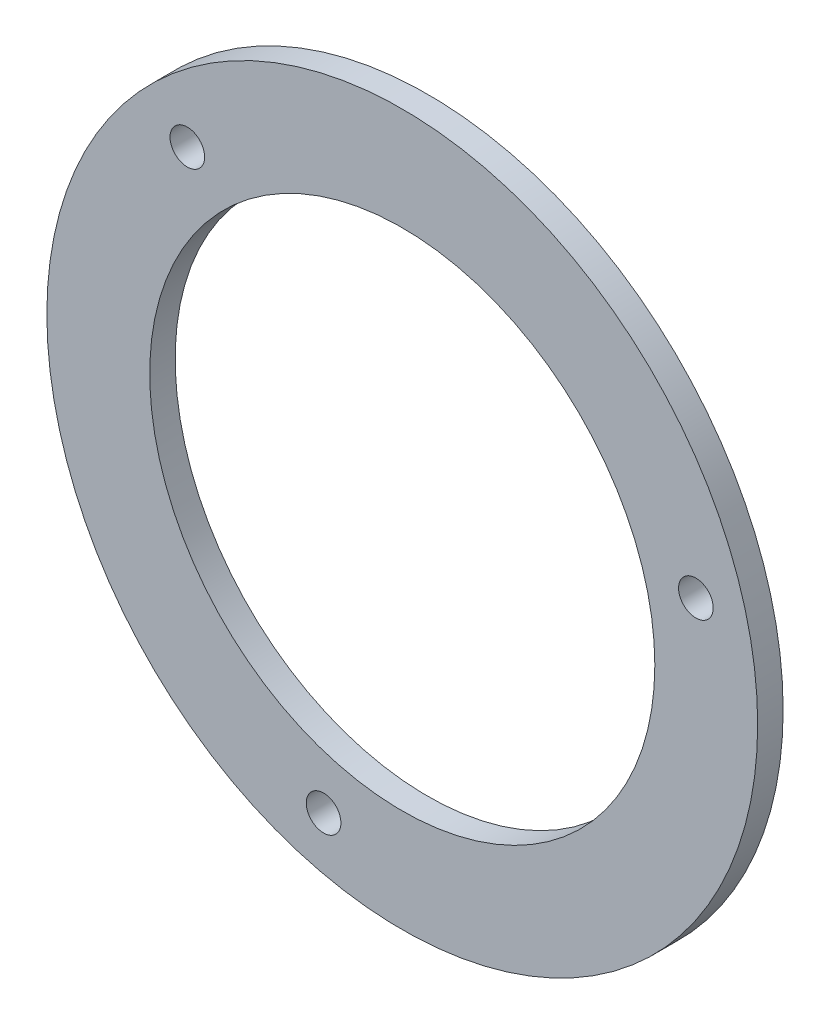
ISO-10303-21;
HEADER;
FILE_DESCRIPTION(('STEP AP214'),'2;1');
FILE_NAME('part.step','',(''),(''),'','','');
FILE_SCHEMA(('AUTOMOTIVE_DESIGN { 1 0 10303 214 1 1 1 1 }'));
ENDSEC;
DATA;
#1=APPLICATION_CONTEXT('core data for automotive mechanical design processes');
#2=APPLICATION_PROTOCOL_DEFINITION('international standard','automotive_design',2000,#1);
#3=PRODUCT_CONTEXT('',#1,'mechanical');
#4=PRODUCT('Part','Part','',(#3));
#5=PRODUCT_RELATED_PRODUCT_CATEGORY('part','',(#4));
#6=PRODUCT_DEFINITION_FORMATION('','',#4);
#7=PRODUCT_DEFINITION_CONTEXT('part definition',#1,'design');
#8=PRODUCT_DEFINITION('design','',#6,#7);
#9=PRODUCT_DEFINITION_SHAPE('','',#8);
#10=(LENGTH_UNIT() NAMED_UNIT(*) SI_UNIT(.MILLI.,.METRE.));
#11=(NAMED_UNIT(*) PLANE_ANGLE_UNIT() SI_UNIT($,.RADIAN.));
#12=(NAMED_UNIT(*) SI_UNIT($,.STERADIAN.) SOLID_ANGLE_UNIT());
#13=UNCERTAINTY_MEASURE_WITH_UNIT(LENGTH_MEASURE(1.E-05),#10,'distance_accuracy_value','');
#14=(GEOMETRIC_REPRESENTATION_CONTEXT(3) GLOBAL_UNCERTAINTY_ASSIGNED_CONTEXT((#13)) GLOBAL_UNIT_ASSIGNED_CONTEXT((#10,
#11,#12)) REPRESENTATION_CONTEXT('',''));
#15=CARTESIAN_POINT('',(0.,0.,0.));
#16=DIRECTION('',(0.,0.,1.));
#17=DIRECTION('',(1.,0.,0.));
#18=AXIS2_PLACEMENT_3D('',#15,#16,#17);
#19=CARTESIAN_POINT('',(0.,0.,2.5));
#20=DIRECTION('',(0.,0.,1.));
#21=DIRECTION('',(1.,0.,0.));
#22=AXIS2_PLACEMENT_3D('',#19,#20,#21);
#23=PLANE('',#22);
#24=CARTESIAN_POINT('',(28.8328859147287,7.72574849631024,2.5));
#25=DIRECTION('',(0.,0.,1.));
#26=DIRECTION('',(1.,0.,0.));
#27=AXIS2_PLACEMENT_3D('',#24,#25,#26);
#28=CIRCLE('',#27,1.7);
#29=CARTESIAN_POINT('',(27.1328859147287,7.72574849631024,2.5));
#30=VERTEX_POINT('',#29);
#31=EDGE_CURVE('E72',#30,#30,#28,.F.);
#32=ORIENTED_EDGE('',*,*,#31,.T.);
#33=EDGE_LOOP('',(#32));
#34=FACE_BOUND('',#33,.T.);
#35=CARTESIAN_POINT('',(-21.1071374184184,21.1071374184184,2.5));
#36=DIRECTION('',(0.,0.,1.));
#37=DIRECTION('',(1.,0.,0.));
#38=AXIS2_PLACEMENT_3D('',#35,#36,#37);
#39=CIRCLE('',#38,1.7);
#40=CARTESIAN_POINT('',(-22.8071374184184,21.1071374184184,2.5));
#41=VERTEX_POINT('',#40);
#42=EDGE_CURVE('E61',#41,#41,#39,.F.);
#43=ORIENTED_EDGE('',*,*,#42,.T.);
#44=EDGE_LOOP('',(#43));
#45=FACE_BOUND('',#44,.T.);
#46=CARTESIAN_POINT('',(-7.72574849631024,-28.8328859147287,2.5));
#47=DIRECTION('',(0.,0.,1.));
#48=DIRECTION('',(1.,0.,0.));
#49=AXIS2_PLACEMENT_3D('',#46,#47,#48);
#50=CIRCLE('',#49,1.7);
#51=CARTESIAN_POINT('',(-9.42574849631024,-28.8328859147287,2.5));
#52=VERTEX_POINT('',#51);
#53=EDGE_CURVE('E59',#52,#52,#50,.F.);
#54=ORIENTED_EDGE('',*,*,#53,.T.);
#55=EDGE_LOOP('',(#54));
#56=FACE_BOUND('',#55,.T.);
#57=CARTESIAN_POINT('',(0.,0.,2.5));
#58=DIRECTION('',(0.,0.,1.));
#59=DIRECTION('',(1.,0.,0.));
#60=AXIS2_PLACEMENT_3D('',#57,#58,#59);
#61=CIRCLE('',#60,34.9);
#62=CARTESIAN_POINT('',(34.9,0.,2.5));
#63=VERTEX_POINT('',#62);
#64=EDGE_CURVE('E10',#63,#63,#61,.T.);
#65=ORIENTED_EDGE('',*,*,#64,.T.);
#66=EDGE_LOOP('',(#65));
#67=FACE_BOUND('',#66,.T.);
#68=CARTESIAN_POINT('',(0.,0.,2.5));
#69=DIRECTION('',(0.,0.,1.));
#70=DIRECTION('',(1.,0.,0.));
#71=AXIS2_PLACEMENT_3D('',#68,#69,#70);
#72=CIRCLE('',#71,24.8);
#73=CARTESIAN_POINT('',(24.8,0.,2.5));
#74=VERTEX_POINT('',#73);
#75=EDGE_CURVE('E49',#74,#74,#72,.T.);
#76=ORIENTED_EDGE('',*,*,#75,.F.);
#77=EDGE_LOOP('',(#76));
#78=FACE_BOUND('',#77,.T.);
#79=ADVANCED_FACE('F40',(#34,#45,#56,#67,#78),#23,.T.);
#80=CARTESIAN_POINT('',(0.,0.,0.));
#81=DIRECTION('',(0.,0.,1.));
#82=DIRECTION('',(1.,0.,0.));
#83=AXIS2_PLACEMENT_3D('',#80,#81,#82);
#84=PLANE('',#83);
#85=CARTESIAN_POINT('',(28.8328859147287,7.72574849631024,0.));
#86=DIRECTION('',(0.,0.,1.));
#87=DIRECTION('',(1.,0.,0.));
#88=AXIS2_PLACEMENT_3D('',#85,#86,#87);
#89=CIRCLE('',#88,1.7);
#90=CARTESIAN_POINT('',(27.1328859147287,7.72574849631024,0.));
#91=VERTEX_POINT('',#90);
#92=EDGE_CURVE('E41',#91,#91,#89,.F.);
#93=ORIENTED_EDGE('',*,*,#92,.F.);
#94=EDGE_LOOP('',(#93));
#95=FACE_BOUND('',#94,.T.);
#96=CARTESIAN_POINT('',(-21.1071374184184,21.1071374184184,0.));
#97=DIRECTION('',(0.,0.,1.));
#98=DIRECTION('',(1.,0.,0.));
#99=AXIS2_PLACEMENT_3D('',#96,#97,#98);
#100=CIRCLE('',#99,1.7);
#101=CARTESIAN_POINT('',(-22.8071374184184,21.1071374184184,0.));
#102=VERTEX_POINT('',#101);
#103=EDGE_CURVE('E56',#102,#102,#100,.F.);
#104=ORIENTED_EDGE('',*,*,#103,.F.);
#105=EDGE_LOOP('',(#104));
#106=FACE_BOUND('',#105,.T.);
#107=CARTESIAN_POINT('',(-7.72574849631024,-28.8328859147287,0.));
#108=DIRECTION('',(0.,0.,1.));
#109=DIRECTION('',(1.,0.,0.));
#110=AXIS2_PLACEMENT_3D('',#107,#108,#109);
#111=CIRCLE('',#110,1.7);
#112=CARTESIAN_POINT('',(-9.42574849631024,-28.8328859147287,0.));
#113=VERTEX_POINT('',#112);
#114=EDGE_CURVE('E57',#113,#113,#111,.F.);
#115=ORIENTED_EDGE('',*,*,#114,.F.);
#116=EDGE_LOOP('',(#115));
#117=FACE_BOUND('',#116,.T.);
#118=CARTESIAN_POINT('',(0.,0.,0.));
#119=DIRECTION('',(0.,0.,1.));
#120=DIRECTION('',(1.,0.,0.));
#121=AXIS2_PLACEMENT_3D('',#118,#119,#120);
#122=CIRCLE('',#121,34.9);
#123=CARTESIAN_POINT('',(34.9,0.,0.));
#124=VERTEX_POINT('',#123);
#125=EDGE_CURVE('E44',#124,#124,#122,.T.);
#126=ORIENTED_EDGE('',*,*,#125,.F.);
#127=EDGE_LOOP('',(#126));
#128=FACE_BOUND('',#127,.T.);
#129=CARTESIAN_POINT('',(0.,0.,0.));
#130=DIRECTION('',(0.,0.,1.));
#131=DIRECTION('',(1.,0.,0.));
#132=AXIS2_PLACEMENT_3D('',#129,#130,#131);
#133=CIRCLE('',#132,24.8);
#134=CARTESIAN_POINT('',(24.8,0.,0.));
#135=VERTEX_POINT('',#134);
#136=EDGE_CURVE('E52',#135,#135,#133,.T.);
#137=ORIENTED_EDGE('',*,*,#136,.T.);
#138=EDGE_LOOP('',(#137));
#139=FACE_BOUND('',#138,.T.);
#140=ADVANCED_FACE('F78',(#95,#106,#117,#128,#139),#84,.F.);
#141=CARTESIAN_POINT('',(0.,0.,2.5));
#142=DIRECTION('',(0.,0.,-1.));
#143=DIRECTION('',(-1.,0.,0.));
#144=AXIS2_PLACEMENT_3D('',#141,#142,#143);
#145=CYLINDRICAL_SURFACE('',#144,34.9);
#146=ORIENTED_EDGE('',*,*,#64,.F.);
#147=EDGE_LOOP('',(#146));
#148=FACE_BOUND('',#147,.T.);
#149=ORIENTED_EDGE('',*,*,#125,.T.);
#150=EDGE_LOOP('',(#149));
#151=FACE_BOUND('',#150,.T.);
#152=ADVANCED_FACE('F39',(#148,#151),#145,.T.);
#153=CARTESIAN_POINT('',(0.,0.,2.5));
#154=DIRECTION('',(0.,0.,-1.));
#155=DIRECTION('',(-1.,0.,0.));
#156=AXIS2_PLACEMENT_3D('',#153,#154,#155);
#157=CYLINDRICAL_SURFACE('',#156,24.8);
#158=ORIENTED_EDGE('',*,*,#75,.T.);
#159=EDGE_LOOP('',(#158));
#160=FACE_BOUND('',#159,.T.);
#161=ORIENTED_EDGE('',*,*,#136,.F.);
#162=EDGE_LOOP('',(#161));
#163=FACE_BOUND('',#162,.T.);
#164=ADVANCED_FACE('F81',(#160,#163),#157,.F.);
#165=CARTESIAN_POINT('',(-7.72574849631024,-28.8328859147287,2.6));
#166=DIRECTION('',(0.,0.,-1.));
#167=DIRECTION('',(-1.,0.,0.));
#168=AXIS2_PLACEMENT_3D('',#165,#166,#167);
#169=CYLINDRICAL_SURFACE('',#168,1.7);
#170=CARTESIAN_POINT('',(-9.42574849631024,-28.8328859147287,2.5));
#171=CARTESIAN_POINT('',(-9.42574849631024,-28.8328859147287,2.47395833333333));
#172=CARTESIAN_POINT('',(-9.42574849631024,-28.8328859147287,2.44791666666667));
#173=CARTESIAN_POINT('',(-9.42574849631024,-28.8328859147287,2.39583333333333));
#174=CARTESIAN_POINT('',(-9.42574849631024,-28.8328859147287,2.36979166666667));
#175=CARTESIAN_POINT('',(-9.42574849631024,-28.8328859147287,2.31770833333333));
#176=CARTESIAN_POINT('',(-9.42574849631024,-28.8328859147287,2.29166666666667));
#177=CARTESIAN_POINT('',(-9.42574849631024,-28.8328859147287,2.23958333333333));
#178=CARTESIAN_POINT('',(-9.42574849631024,-28.8328859147287,2.21354166666667));
#179=CARTESIAN_POINT('',(-9.42574849631024,-28.8328859147287,2.16145833333333));
#180=CARTESIAN_POINT('',(-9.42574849631024,-28.8328859147287,2.13541666666667));
#181=CARTESIAN_POINT('',(-9.42574849631024,-28.8328859147287,2.08333333333333));
#182=CARTESIAN_POINT('',(-9.42574849631024,-28.8328859147287,2.05729166666667));
#183=CARTESIAN_POINT('',(-9.42574849631024,-28.8328859147287,2.00520833333333));
#184=CARTESIAN_POINT('',(-9.42574849631024,-28.8328859147287,1.97916666666667));
#185=CARTESIAN_POINT('',(-9.42574849631024,-28.8328859147287,1.92708333333333));
#186=CARTESIAN_POINT('',(-9.42574849631024,-28.8328859147287,1.90104166666667));
#187=CARTESIAN_POINT('',(-9.42574849631024,-28.8328859147287,1.84895833333333));
#188=CARTESIAN_POINT('',(-9.42574849631024,-28.8328859147287,1.82291666666667));
#189=CARTESIAN_POINT('',(-9.42574849631024,-28.8328859147287,1.77083333333333));
#190=CARTESIAN_POINT('',(-9.42574849631024,-28.8328859147287,1.74479166666667));
#191=CARTESIAN_POINT('',(-9.42574849631024,-28.8328859147287,1.69270833333333));
#192=CARTESIAN_POINT('',(-9.42574849631024,-28.8328859147287,1.66666666666667));
#193=CARTESIAN_POINT('',(-9.42574849631024,-28.8328859147287,1.61458333333333));
#194=CARTESIAN_POINT('',(-9.42574849631024,-28.8328859147287,1.58854166666667));
#195=CARTESIAN_POINT('',(-9.42574849631024,-28.8328859147287,1.53645833333333));
#196=CARTESIAN_POINT('',(-9.42574849631024,-28.8328859147287,1.51041666666667));
#197=CARTESIAN_POINT('',(-9.42574849631024,-28.8328859147287,1.45833333333333));
#198=CARTESIAN_POINT('',(-9.42574849631024,-28.8328859147287,1.43229166666667));
#199=CARTESIAN_POINT('',(-9.42574849631024,-28.8328859147287,1.38020833333333));
#200=CARTESIAN_POINT('',(-9.42574849631024,-28.8328859147287,1.35416666666667));
#201=CARTESIAN_POINT('',(-9.42574849631024,-28.8328859147287,1.30208333333333));
#202=CARTESIAN_POINT('',(-9.42574849631024,-28.8328859147287,1.27604166666667));
#203=CARTESIAN_POINT('',(-9.42574849631024,-28.8328859147287,1.22395833333333));
#204=CARTESIAN_POINT('',(-9.42574849631024,-28.8328859147287,1.19791666666667));
#205=CARTESIAN_POINT('',(-9.42574849631024,-28.8328859147287,1.14583333333333));
#206=CARTESIAN_POINT('',(-9.42574849631024,-28.8328859147287,1.11979166666667));
#207=CARTESIAN_POINT('',(-9.42574849631024,-28.8328859147287,1.06770833333333));
#208=CARTESIAN_POINT('',(-9.42574849631024,-28.8328859147287,1.04166666666667));
#209=CARTESIAN_POINT('',(-9.42574849631024,-28.8328859147287,0.989583333333333));
#210=CARTESIAN_POINT('',(-9.42574849631024,-28.8328859147287,0.963541666666667));
#211=CARTESIAN_POINT('',(-9.42574849631024,-28.8328859147287,0.911458333333333));
#212=CARTESIAN_POINT('',(-9.42574849631024,-28.8328859147287,0.885416666666666));
#213=CARTESIAN_POINT('',(-9.42574849631024,-28.8328859147287,0.833333333333333));
#214=CARTESIAN_POINT('',(-9.42574849631024,-28.8328859147287,0.807291666666666));
#215=CARTESIAN_POINT('',(-9.42574849631024,-28.8328859147287,0.755208333333333));
#216=CARTESIAN_POINT('',(-9.42574849631024,-28.8328859147287,0.729166666666667));
#217=CARTESIAN_POINT('',(-9.42574849631024,-28.8328859147287,0.677083333333333));
#218=CARTESIAN_POINT('',(-9.42574849631024,-28.8328859147287,0.651041666666666));
#219=CARTESIAN_POINT('',(-9.42574849631024,-28.8328859147287,0.598958333333333));
#220=CARTESIAN_POINT('',(-9.42574849631024,-28.8328859147287,0.572916666666666));
#221=CARTESIAN_POINT('',(-9.42574849631024,-28.8328859147287,0.520833333333333));
#222=CARTESIAN_POINT('',(-9.42574849631024,-28.8328859147287,0.494791666666666));
#223=CARTESIAN_POINT('',(-9.42574849631024,-28.8328859147287,0.442708333333333));
#224=CARTESIAN_POINT('',(-9.42574849631024,-28.8328859147287,0.416666666666666));
#225=CARTESIAN_POINT('',(-9.42574849631024,-28.8328859147287,0.364583333333333));
#226=CARTESIAN_POINT('',(-9.42574849631024,-28.8328859147287,0.338541666666667));
#227=CARTESIAN_POINT('',(-9.42574849631024,-28.8328859147287,0.286458333333334));
#228=CARTESIAN_POINT('',(-9.42574849631024,-28.8328859147287,0.260416666666667));
#229=CARTESIAN_POINT('',(-9.42574849631024,-28.8328859147287,0.208333333333334));
#230=CARTESIAN_POINT('',(-9.42574849631024,-28.8328859147287,0.182291666666667));
#231=CARTESIAN_POINT('',(-9.42574849631024,-28.8328859147287,0.130208333333333));
#232=CARTESIAN_POINT('',(-9.42574849631024,-28.8328859147287,0.104166666666667));
#233=CARTESIAN_POINT('',(-9.42574849631024,-28.8328859147287,0.0520833333333334));
#234=CARTESIAN_POINT('',(-9.42574849631024,-28.8328859147287,0.0260416666666667));
#235=CARTESIAN_POINT('',(-9.42574849631024,-28.8328859147287,0.));
#236=B_SPLINE_CURVE_WITH_KNOTS('',3,(#170,#171,#172,#173,#174,#175,#176,#177,#178,#179,#180,
#181,#182,#183,#184,#185,#186,#187,#188,#189,#190,#191,#192,#193,#194,#195,#196,#197,#198,#199,
#200,#201,#202,#203,#204,#205,#206,#207,#208,#209,#210,#211,#212,#213,#214,#215,#216,#217,#218,
#219,#220,#221,#222,#223,#224,#225,#226,#227,#228,#229,#230,#231,#232,#233,#234,#235),
.UNSPECIFIED.,.F.,.F.,(4,2,2,2,2,2,2,2,2,2,2,2,2,2,2,2,2,2,2,2,2,2,2,2,2,2,2,2,2,2,2,2,4),(0.,
0.0781250000000001,0.15625,0.234375,0.3125,0.390625,0.46875,0.546875,0.625,0.703125,0.78125,
0.859375,0.9375,1.015625,1.09375,1.171875,1.25,1.328125,1.40625,1.484375,1.5625,1.640625,
1.71875,1.796875,1.875,1.953125,2.03125,2.109375,2.1875,2.265625,2.34375,2.421875,2.5),.UNSPECIFIED.);
#237=EDGE_CURVE('BSEAM82',#52,#113,#236,.T.);
#238=ORIENTED_EDGE('',*,*,#53,.F.);
#239=ORIENTED_EDGE('',*,*,#114,.T.);
#240=ORIENTED_EDGE('',*,*,#237,.T.);
#241=ORIENTED_EDGE('',*,*,#237,.F.);
#242=EDGE_LOOP('',(#238,#240,#239,#241));
#243=FACE_BOUND('',#242,.T.);
#244=ADVANCED_FACE('F82',(#243),#169,.F.);
#245=CARTESIAN_POINT('',(-21.1071374184184,21.1071374184184,2.6));
#246=DIRECTION('',(0.,0.,-1.));
#247=DIRECTION('',(-1.,0.,0.));
#248=AXIS2_PLACEMENT_3D('',#245,#246,#247);
#249=CYLINDRICAL_SURFACE('',#248,1.7);
#250=CARTESIAN_POINT('',(-22.8071374184184,21.1071374184184,2.5));
#251=CARTESIAN_POINT('',(-22.8071374184184,21.1071374184184,2.47395833333333));
#252=CARTESIAN_POINT('',(-22.8071374184184,21.1071374184184,2.44791666666667));
#253=CARTESIAN_POINT('',(-22.8071374184184,21.1071374184184,2.39583333333333));
#254=CARTESIAN_POINT('',(-22.8071374184184,21.1071374184184,2.36979166666667));
#255=CARTESIAN_POINT('',(-22.8071374184184,21.1071374184184,2.31770833333333));
#256=CARTESIAN_POINT('',(-22.8071374184184,21.1071374184184,2.29166666666667));
#257=CARTESIAN_POINT('',(-22.8071374184184,21.1071374184184,2.23958333333333));
#258=CARTESIAN_POINT('',(-22.8071374184184,21.1071374184184,2.21354166666667));
#259=CARTESIAN_POINT('',(-22.8071374184184,21.1071374184184,2.16145833333333));
#260=CARTESIAN_POINT('',(-22.8071374184184,21.1071374184184,2.13541666666667));
#261=CARTESIAN_POINT('',(-22.8071374184184,21.1071374184184,2.08333333333333));
#262=CARTESIAN_POINT('',(-22.8071374184184,21.1071374184184,2.05729166666667));
#263=CARTESIAN_POINT('',(-22.8071374184184,21.1071374184184,2.00520833333333));
#264=CARTESIAN_POINT('',(-22.8071374184184,21.1071374184184,1.97916666666667));
#265=CARTESIAN_POINT('',(-22.8071374184184,21.1071374184184,1.92708333333333));
#266=CARTESIAN_POINT('',(-22.8071374184184,21.1071374184184,1.90104166666667));
#267=CARTESIAN_POINT('',(-22.8071374184184,21.1071374184184,1.84895833333333));
#268=CARTESIAN_POINT('',(-22.8071374184184,21.1071374184184,1.82291666666667));
#269=CARTESIAN_POINT('',(-22.8071374184184,21.1071374184184,1.77083333333333));
#270=CARTESIAN_POINT('',(-22.8071374184184,21.1071374184184,1.74479166666667));
#271=CARTESIAN_POINT('',(-22.8071374184184,21.1071374184184,1.69270833333333));
#272=CARTESIAN_POINT('',(-22.8071374184184,21.1071374184184,1.66666666666667));
#273=CARTESIAN_POINT('',(-22.8071374184184,21.1071374184184,1.61458333333333));
#274=CARTESIAN_POINT('',(-22.8071374184184,21.1071374184184,1.58854166666667));
#275=CARTESIAN_POINT('',(-22.8071374184184,21.1071374184184,1.53645833333333));
#276=CARTESIAN_POINT('',(-22.8071374184184,21.1071374184184,1.51041666666667));
#277=CARTESIAN_POINT('',(-22.8071374184184,21.1071374184184,1.45833333333333));
#278=CARTESIAN_POINT('',(-22.8071374184184,21.1071374184184,1.43229166666667));
#279=CARTESIAN_POINT('',(-22.8071374184184,21.1071374184184,1.38020833333333));
#280=CARTESIAN_POINT('',(-22.8071374184184,21.1071374184184,1.35416666666667));
#281=CARTESIAN_POINT('',(-22.8071374184184,21.1071374184184,1.30208333333333));
#282=CARTESIAN_POINT('',(-22.8071374184184,21.1071374184184,1.27604166666667));
#283=CARTESIAN_POINT('',(-22.8071374184184,21.1071374184184,1.22395833333333));
#284=CARTESIAN_POINT('',(-22.8071374184184,21.1071374184184,1.19791666666667));
#285=CARTESIAN_POINT('',(-22.8071374184184,21.1071374184184,1.14583333333333));
#286=CARTESIAN_POINT('',(-22.8071374184184,21.1071374184184,1.11979166666667));
#287=CARTESIAN_POINT('',(-22.8071374184184,21.1071374184184,1.06770833333333));
#288=CARTESIAN_POINT('',(-22.8071374184184,21.1071374184184,1.04166666666667));
#289=CARTESIAN_POINT('',(-22.8071374184184,21.1071374184184,0.989583333333333));
#290=CARTESIAN_POINT('',(-22.8071374184184,21.1071374184184,0.963541666666667));
#291=CARTESIAN_POINT('',(-22.8071374184184,21.1071374184184,0.911458333333333));
#292=CARTESIAN_POINT('',(-22.8071374184184,21.1071374184184,0.885416666666666));
#293=CARTESIAN_POINT('',(-22.8071374184184,21.1071374184184,0.833333333333333));
#294=CARTESIAN_POINT('',(-22.8071374184184,21.1071374184184,0.807291666666666));
#295=CARTESIAN_POINT('',(-22.8071374184184,21.1071374184184,0.755208333333333));
#296=CARTESIAN_POINT('',(-22.8071374184184,21.1071374184184,0.729166666666667));
#297=CARTESIAN_POINT('',(-22.8071374184184,21.1071374184184,0.677083333333333));
#298=CARTESIAN_POINT('',(-22.8071374184184,21.1071374184184,0.651041666666666));
#299=CARTESIAN_POINT('',(-22.8071374184184,21.1071374184184,0.598958333333333));
#300=CARTESIAN_POINT('',(-22.8071374184184,21.1071374184184,0.572916666666666));
#301=CARTESIAN_POINT('',(-22.8071374184184,21.1071374184184,0.520833333333333));
#302=CARTESIAN_POINT('',(-22.8071374184184,21.1071374184184,0.494791666666666));
#303=CARTESIAN_POINT('',(-22.8071374184184,21.1071374184184,0.442708333333333));
#304=CARTESIAN_POINT('',(-22.8071374184184,21.1071374184184,0.416666666666666));
#305=CARTESIAN_POINT('',(-22.8071374184184,21.1071374184184,0.364583333333333));
#306=CARTESIAN_POINT('',(-22.8071374184184,21.1071374184184,0.338541666666667));
#307=CARTESIAN_POINT('',(-22.8071374184184,21.1071374184184,0.286458333333334));
#308=CARTESIAN_POINT('',(-22.8071374184184,21.1071374184184,0.260416666666667));
#309=CARTESIAN_POINT('',(-22.8071374184184,21.1071374184184,0.208333333333334));
#310=CARTESIAN_POINT('',(-22.8071374184184,21.1071374184184,0.182291666666667));
#311=CARTESIAN_POINT('',(-22.8071374184184,21.1071374184184,0.130208333333333));
#312=CARTESIAN_POINT('',(-22.8071374184184,21.1071374184184,0.104166666666667));
#313=CARTESIAN_POINT('',(-22.8071374184184,21.1071374184184,0.0520833333333334));
#314=CARTESIAN_POINT('',(-22.8071374184184,21.1071374184184,0.0260416666666667));
#315=CARTESIAN_POINT('',(-22.8071374184184,21.1071374184184,0.));
#316=B_SPLINE_CURVE_WITH_KNOTS('',3,(#250,#251,#252,#253,#254,#255,#256,#257,#258,#259,#260,
#261,#262,#263,#264,#265,#266,#267,#268,#269,#270,#271,#272,#273,#274,#275,#276,#277,#278,#279,
#280,#281,#282,#283,#284,#285,#286,#287,#288,#289,#290,#291,#292,#293,#294,#295,#296,#297,#298,
#299,#300,#301,#302,#303,#304,#305,#306,#307,#308,#309,#310,#311,#312,#313,#314,#315),
.UNSPECIFIED.,.F.,.F.,(4,2,2,2,2,2,2,2,2,2,2,2,2,2,2,2,2,2,2,2,2,2,2,2,2,2,2,2,2,2,2,2,4),(0.,
0.0781250000000001,0.15625,0.234375,0.3125,0.390625,0.46875,0.546875,0.625,0.703125,0.78125,
0.859375,0.9375,1.015625,1.09375,1.171875,1.25,1.328125,1.40625,1.484375,1.5625,1.640625,
1.71875,1.796875,1.875,1.953125,2.03125,2.109375,2.1875,2.265625,2.34375,2.421875,2.5),.UNSPECIFIED.);
#317=EDGE_CURVE('BSEAM89',#41,#102,#316,.T.);
#318=ORIENTED_EDGE('',*,*,#42,.F.);
#319=ORIENTED_EDGE('',*,*,#103,.T.);
#320=ORIENTED_EDGE('',*,*,#317,.T.);
#321=ORIENTED_EDGE('',*,*,#317,.F.);
#322=EDGE_LOOP('',(#318,#320,#319,#321));
#323=FACE_BOUND('',#322,.T.);
#324=ADVANCED_FACE('F89',(#323),#249,.F.);
#325=CARTESIAN_POINT('',(28.8328859147287,7.72574849631024,2.6));
#326=DIRECTION('',(0.,0.,-1.));
#327=DIRECTION('',(-1.,0.,0.));
#328=AXIS2_PLACEMENT_3D('',#325,#326,#327);
#329=CYLINDRICAL_SURFACE('',#328,1.7);
#330=CARTESIAN_POINT('',(27.1328859147287,7.72574849631024,2.5));
#331=CARTESIAN_POINT('',(27.1328859147287,7.72574849631024,2.47395833333333));
#332=CARTESIAN_POINT('',(27.1328859147287,7.72574849631024,2.44791666666667));
#333=CARTESIAN_POINT('',(27.1328859147287,7.72574849631024,2.39583333333333));
#334=CARTESIAN_POINT('',(27.1328859147287,7.72574849631024,2.36979166666667));
#335=CARTESIAN_POINT('',(27.1328859147287,7.72574849631024,2.31770833333333));
#336=CARTESIAN_POINT('',(27.1328859147287,7.72574849631024,2.29166666666667));
#337=CARTESIAN_POINT('',(27.1328859147287,7.72574849631024,2.23958333333333));
#338=CARTESIAN_POINT('',(27.1328859147287,7.72574849631024,2.21354166666667));
#339=CARTESIAN_POINT('',(27.1328859147287,7.72574849631024,2.16145833333333));
#340=CARTESIAN_POINT('',(27.1328859147287,7.72574849631024,2.13541666666667));
#341=CARTESIAN_POINT('',(27.1328859147287,7.72574849631024,2.08333333333333));
#342=CARTESIAN_POINT('',(27.1328859147287,7.72574849631024,2.05729166666667));
#343=CARTESIAN_POINT('',(27.1328859147287,7.72574849631024,2.00520833333333));
#344=CARTESIAN_POINT('',(27.1328859147287,7.72574849631024,1.97916666666667));
#345=CARTESIAN_POINT('',(27.1328859147287,7.72574849631024,1.92708333333333));
#346=CARTESIAN_POINT('',(27.1328859147287,7.72574849631024,1.90104166666667));
#347=CARTESIAN_POINT('',(27.1328859147287,7.72574849631024,1.84895833333333));
#348=CARTESIAN_POINT('',(27.1328859147287,7.72574849631024,1.82291666666667));
#349=CARTESIAN_POINT('',(27.1328859147287,7.72574849631024,1.77083333333333));
#350=CARTESIAN_POINT('',(27.1328859147287,7.72574849631024,1.74479166666667));
#351=CARTESIAN_POINT('',(27.1328859147287,7.72574849631024,1.69270833333333));
#352=CARTESIAN_POINT('',(27.1328859147287,7.72574849631024,1.66666666666667));
#353=CARTESIAN_POINT('',(27.1328859147287,7.72574849631024,1.61458333333333));
#354=CARTESIAN_POINT('',(27.1328859147287,7.72574849631024,1.58854166666667));
#355=CARTESIAN_POINT('',(27.1328859147287,7.72574849631024,1.53645833333333));
#356=CARTESIAN_POINT('',(27.1328859147287,7.72574849631024,1.51041666666667));
#357=CARTESIAN_POINT('',(27.1328859147287,7.72574849631024,1.45833333333333));
#358=CARTESIAN_POINT('',(27.1328859147287,7.72574849631024,1.43229166666667));
#359=CARTESIAN_POINT('',(27.1328859147287,7.72574849631024,1.38020833333333));
#360=CARTESIAN_POINT('',(27.1328859147287,7.72574849631024,1.35416666666667));
#361=CARTESIAN_POINT('',(27.1328859147287,7.72574849631024,1.30208333333333));
#362=CARTESIAN_POINT('',(27.1328859147287,7.72574849631024,1.27604166666667));
#363=CARTESIAN_POINT('',(27.1328859147287,7.72574849631024,1.22395833333333));
#364=CARTESIAN_POINT('',(27.1328859147287,7.72574849631024,1.19791666666667));
#365=CARTESIAN_POINT('',(27.1328859147287,7.72574849631024,1.14583333333333));
#366=CARTESIAN_POINT('',(27.1328859147287,7.72574849631024,1.11979166666667));
#367=CARTESIAN_POINT('',(27.1328859147287,7.72574849631024,1.06770833333333));
#368=CARTESIAN_POINT('',(27.1328859147287,7.72574849631024,1.04166666666667));
#369=CARTESIAN_POINT('',(27.1328859147287,7.72574849631024,0.989583333333333));
#370=CARTESIAN_POINT('',(27.1328859147287,7.72574849631024,0.963541666666667));
#371=CARTESIAN_POINT('',(27.1328859147287,7.72574849631024,0.911458333333333));
#372=CARTESIAN_POINT('',(27.1328859147287,7.72574849631024,0.885416666666666));
#373=CARTESIAN_POINT('',(27.1328859147287,7.72574849631024,0.833333333333333));
#374=CARTESIAN_POINT('',(27.1328859147287,7.72574849631024,0.807291666666666));
#375=CARTESIAN_POINT('',(27.1328859147287,7.72574849631024,0.755208333333333));
#376=CARTESIAN_POINT('',(27.1328859147287,7.72574849631024,0.729166666666667));
#377=CARTESIAN_POINT('',(27.1328859147287,7.72574849631024,0.677083333333333));
#378=CARTESIAN_POINT('',(27.1328859147287,7.72574849631024,0.651041666666666));
#379=CARTESIAN_POINT('',(27.1328859147287,7.72574849631024,0.598958333333333));
#380=CARTESIAN_POINT('',(27.1328859147287,7.72574849631024,0.572916666666666));
#381=CARTESIAN_POINT('',(27.1328859147287,7.72574849631024,0.520833333333333));
#382=CARTESIAN_POINT('',(27.1328859147287,7.72574849631024,0.494791666666666));
#383=CARTESIAN_POINT('',(27.1328859147287,7.72574849631024,0.442708333333333));
#384=CARTESIAN_POINT('',(27.1328859147287,7.72574849631024,0.416666666666666));
#385=CARTESIAN_POINT('',(27.1328859147287,7.72574849631024,0.364583333333333));
#386=CARTESIAN_POINT('',(27.1328859147287,7.72574849631024,0.338541666666667));
#387=CARTESIAN_POINT('',(27.1328859147287,7.72574849631024,0.286458333333334));
#388=CARTESIAN_POINT('',(27.1328859147287,7.72574849631024,0.260416666666667));
#389=CARTESIAN_POINT('',(27.1328859147287,7.72574849631024,0.208333333333334));
#390=CARTESIAN_POINT('',(27.1328859147287,7.72574849631024,0.182291666666667));
#391=CARTESIAN_POINT('',(27.1328859147287,7.72574849631024,0.130208333333333));
#392=CARTESIAN_POINT('',(27.1328859147287,7.72574849631024,0.104166666666667));
#393=CARTESIAN_POINT('',(27.1328859147287,7.72574849631024,0.0520833333333334));
#394=CARTESIAN_POINT('',(27.1328859147287,7.72574849631024,0.0260416666666667));
#395=CARTESIAN_POINT('',(27.1328859147287,7.72574849631024,0.));
#396=B_SPLINE_CURVE_WITH_KNOTS('',3,(#330,#331,#332,#333,#334,#335,#336,#337,#338,#339,#340,
#341,#342,#343,#344,#345,#346,#347,#348,#349,#350,#351,#352,#353,#354,#355,#356,#357,#358,#359,
#360,#361,#362,#363,#364,#365,#366,#367,#368,#369,#370,#371,#372,#373,#374,#375,#376,#377,#378,
#379,#380,#381,#382,#383,#384,#385,#386,#387,#388,#389,#390,#391,#392,#393,#394,#395),
.UNSPECIFIED.,.F.,.F.,(4,2,2,2,2,2,2,2,2,2,2,2,2,2,2,2,2,2,2,2,2,2,2,2,2,2,2,2,2,2,2,2,4),(0.,
0.0781250000000001,0.15625,0.234375,0.3125,0.390625,0.46875,0.546875,0.625,0.703125,0.78125,
0.859375,0.9375,1.015625,1.09375,1.171875,1.25,1.328125,1.40625,1.484375,1.5625,1.640625,
1.71875,1.796875,1.875,1.953125,2.03125,2.109375,2.1875,2.265625,2.34375,2.421875,2.5),.UNSPECIFIED.);
#397=EDGE_CURVE('BSEAM106',#30,#91,#396,.T.);
#398=ORIENTED_EDGE('',*,*,#31,.F.);
#399=ORIENTED_EDGE('',*,*,#92,.T.);
#400=ORIENTED_EDGE('',*,*,#397,.T.);
#401=ORIENTED_EDGE('',*,*,#397,.F.);
#402=EDGE_LOOP('',(#398,#400,#399,#401));
#403=FACE_BOUND('',#402,.T.);
#404=ADVANCED_FACE('F106',(#403),#329,.F.);
#405=CLOSED_SHELL('',(#79,#140,#152,#164,#244,#324,#404));
#406=MANIFOLD_SOLID_BREP('B2',#405);
#407=ADVANCED_BREP_SHAPE_REPRESENTATION('',(#18,#406),#14);
#408=SHAPE_DEFINITION_REPRESENTATION(#9,#407);
ENDSEC;
END-ISO-10303-21;
